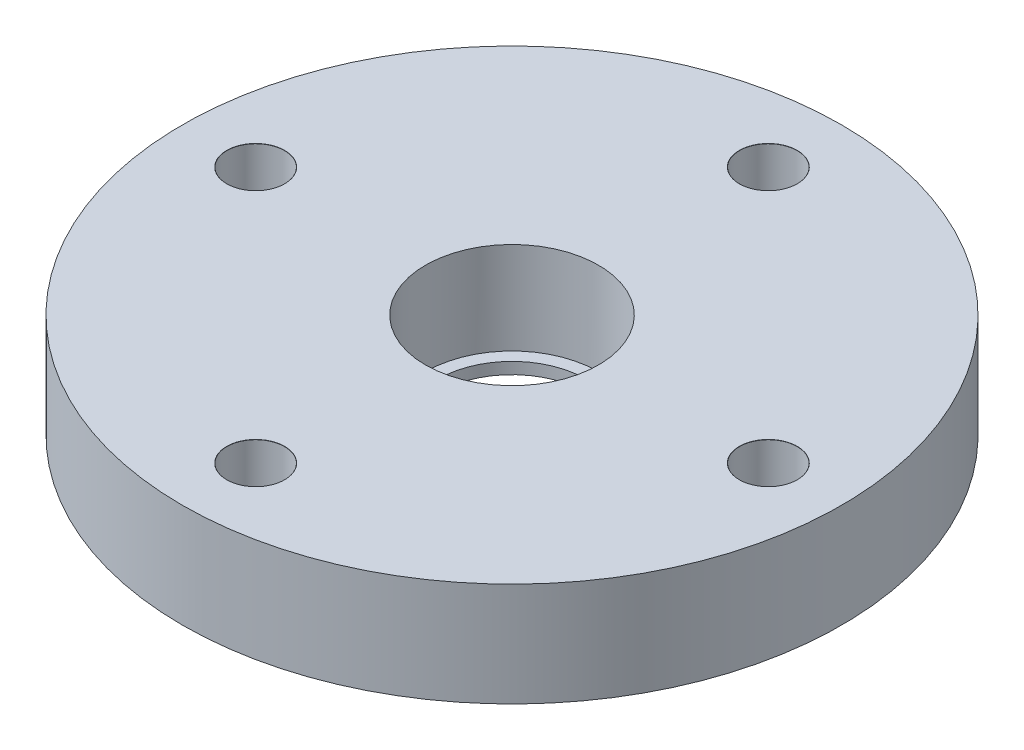
ISO-10303-21;
HEADER;
FILE_DESCRIPTION(('STEP AP214'),'2;1');
FILE_NAME('part.step','',(''),(''),'','','');
FILE_SCHEMA(('AUTOMOTIVE_DESIGN { 1 0 10303 214 1 1 1 1 }'));
ENDSEC;
DATA;
#1=APPLICATION_CONTEXT('core data for automotive mechanical design processes');
#2=APPLICATION_PROTOCOL_DEFINITION('international standard','automotive_design',2000,#1);
#3=PRODUCT_CONTEXT('',#1,'mechanical');
#4=PRODUCT('Part','Part','',(#3));
#5=PRODUCT_RELATED_PRODUCT_CATEGORY('part','',(#4));
#6=PRODUCT_DEFINITION_FORMATION('','',#4);
#7=PRODUCT_DEFINITION_CONTEXT('part definition',#1,'design');
#8=PRODUCT_DEFINITION('design','',#6,#7);
#9=PRODUCT_DEFINITION_SHAPE('','',#8);
#10=(LENGTH_UNIT() NAMED_UNIT(*) SI_UNIT(.MILLI.,.METRE.));
#11=(NAMED_UNIT(*) PLANE_ANGLE_UNIT() SI_UNIT($,.RADIAN.));
#12=(NAMED_UNIT(*) SI_UNIT($,.STERADIAN.) SOLID_ANGLE_UNIT());
#13=UNCERTAINTY_MEASURE_WITH_UNIT(LENGTH_MEASURE(1.E-05),#10,'distance_accuracy_value','');
#14=(GEOMETRIC_REPRESENTATION_CONTEXT(3) GLOBAL_UNCERTAINTY_ASSIGNED_CONTEXT((#13)) GLOBAL_UNIT_ASSIGNED_CONTEXT((#10,
#11,#12)) REPRESENTATION_CONTEXT('',''));
#15=CARTESIAN_POINT('',(0.,0.,0.));
#16=DIRECTION('',(0.,0.,1.));
#17=DIRECTION('',(1.,0.,0.));
#18=AXIS2_PLACEMENT_3D('',#15,#16,#17);
#19=CARTESIAN_POINT('',(0.,175.644610179245,0.));
#20=DIRECTION('',(0.,-1.,0.));
#21=DIRECTION('',(0.,0.,-1.));
#22=AXIS2_PLACEMENT_3D('',#19,#20,#21);
#23=CYLINDRICAL_SURFACE('',#22,57.15);
#24=CARTESIAN_POINT('',(0.,-2.,0.));
#25=DIRECTION('',(0.,-1.,0.));
#26=DIRECTION('',(0.,0.,-1.));
#27=AXIS2_PLACEMENT_3D('',#24,#25,#26);
#28=CIRCLE('',#27,57.15);
#29=CARTESIAN_POINT('',(0.,-2.,-57.15));
#30=VERTEX_POINT('',#29);
#31=EDGE_CURVE('E41',#30,#30,#28,.T.);
#32=ORIENTED_EDGE('',*,*,#31,.F.);
#33=EDGE_LOOP('',(#32));
#34=FACE_BOUND('',#33,.T.);
#35=CARTESIAN_POINT('',(0.,16.,0.));
#36=DIRECTION('',(0.,1.,0.));
#37=DIRECTION('',(0.,0.,1.));
#38=AXIS2_PLACEMENT_3D('',#35,#36,#37);
#39=CIRCLE('',#38,57.15);
#40=CARTESIAN_POINT('',(0.,16.,57.15));
#41=VERTEX_POINT('',#40);
#42=EDGE_CURVE('E53',#41,#41,#39,.T.);
#43=ORIENTED_EDGE('',*,*,#42,.F.);
#44=EDGE_LOOP('',(#43));
#45=FACE_BOUND('',#44,.T.);
#46=ADVANCED_FACE('F35',(#34,#45),#23,.T.);
#47=CARTESIAN_POINT('',(0.,-42.4264068711929,0.));
#48=DIRECTION('',(0.,1.,0.));
#49=DIRECTION('',(0.,0.,1.));
#50=AXIS2_PLACEMENT_3D('',#47,#48,#49);
#51=CYLINDRICAL_SURFACE('',#50,15.);
#52=CARTESIAN_POINT('',(0.,0.,0.));
#53=DIRECTION('',(0.,-1.,0.));
#54=DIRECTION('',(0.,0.,-1.));
#55=AXIS2_PLACEMENT_3D('',#52,#53,#54);
#56=CIRCLE('',#55,15.);
#57=CARTESIAN_POINT('',(0.,0.,-15.));
#58=VERTEX_POINT('',#57);
#59=EDGE_CURVE('E10',#58,#58,#56,.F.);
#60=ORIENTED_EDGE('',*,*,#59,.F.);
#61=EDGE_LOOP('',(#60));
#62=FACE_BOUND('',#61,.T.);
#63=CARTESIAN_POINT('',(0.,16.,0.));
#64=DIRECTION('',(0.,1.,0.));
#65=DIRECTION('',(0.,0.,1.));
#66=AXIS2_PLACEMENT_3D('',#63,#64,#65);
#67=CIRCLE('',#66,15.);
#68=CARTESIAN_POINT('',(0.,16.,15.));
#69=VERTEX_POINT('',#68);
#70=EDGE_CURVE('E57',#69,#69,#67,.T.);
#71=ORIENTED_EDGE('',*,*,#70,.T.);
#72=EDGE_LOOP('',(#71));
#73=FACE_BOUND('',#72,.T.);
#74=ADVANCED_FACE('F147',(#62,#73),#51,.F.);
#75=CARTESIAN_POINT('',(0.,0.,0.));
#76=DIRECTION('',(0.,-1.,0.));
#77=DIRECTION('',(0.,0.,-1.));
#78=AXIS2_PLACEMENT_3D('',#75,#76,#77);
#79=PLANE('',#78);
#80=CARTESIAN_POINT('',(0.,0.,0.));
#81=DIRECTION('',(0.,-1.,0.));
#82=DIRECTION('',(0.,0.,-1.));
#83=AXIS2_PLACEMENT_3D('',#80,#81,#82);
#84=CIRCLE('',#83,12.8);
#85=CARTESIAN_POINT('',(0.,0.,-12.8));
#86=VERTEX_POINT('',#85);
#87=EDGE_CURVE('E49',#86,#86,#84,.T.);
#88=ORIENTED_EDGE('',*,*,#87,.T.);
#89=EDGE_LOOP('',(#88));
#90=FACE_BOUND('',#89,.T.);
#91=ORIENTED_EDGE('',*,*,#59,.T.);
#92=EDGE_LOOP('',(#91));
#93=FACE_BOUND('',#92,.T.);
#94=ADVANCED_FACE('F149',(#90,#93),#79,.F.);
#95=CARTESIAN_POINT('',(0.,-2.,0.));
#96=DIRECTION('',(0.,-1.,0.));
#97=DIRECTION('',(0.,0.,-1.));
#98=AXIS2_PLACEMENT_3D('',#95,#96,#97);
#99=PLANE('',#98);
#100=CARTESIAN_POINT('',(0.,-2.,-44.45));
#101=DIRECTION('',(0.,1.,0.));
#102=DIRECTION('',(0.,0.,1.));
#103=AXIS2_PLACEMENT_3D('',#100,#101,#102);
#104=CIRCLE('',#103,5.025);
#105=CARTESIAN_POINT('',(0.,-2.,-39.425));
#106=VERTEX_POINT('',#105);
#107=EDGE_CURVE('E105',#106,#106,#104,.T.);
#108=ORIENTED_EDGE('',*,*,#107,.T.);
#109=EDGE_LOOP('',(#108));
#110=FACE_BOUND('',#109,.T.);
#111=CARTESIAN_POINT('',(44.4500000000025,-2.,-2.52124641334071E-12));
#112=DIRECTION('',(0.,1.,0.));
#113=DIRECTION('',(0.,0.,1.));
#114=AXIS2_PLACEMENT_3D('',#111,#112,#113);
#115=CIRCLE('',#114,5.025);
#116=CARTESIAN_POINT('',(44.4500000000025,-2.,5.02499999999747));
#117=VERTEX_POINT('',#116);
#118=EDGE_CURVE('E93',#117,#117,#115,.T.);
#119=ORIENTED_EDGE('',*,*,#118,.T.);
#120=EDGE_LOOP('',(#119));
#121=FACE_BOUND('',#120,.T.);
#122=CARTESIAN_POINT('',(5.04249282668141E-12,-2.,44.45));
#123=DIRECTION('',(0.,1.,0.));
#124=DIRECTION('',(0.,0.,1.));
#125=AXIS2_PLACEMENT_3D('',#122,#123,#124);
#126=CIRCLE('',#125,5.025);
#127=CARTESIAN_POINT('',(5.04249282668141E-12,-2.,49.475));
#128=VERTEX_POINT('',#127);
#129=EDGE_CURVE('E81',#128,#128,#126,.T.);
#130=ORIENTED_EDGE('',*,*,#129,.T.);
#131=EDGE_LOOP('',(#130));
#132=FACE_BOUND('',#131,.T.);
#133=CARTESIAN_POINT('',(-44.4499999999975,-2.,2.5158028583185E-12));
#134=DIRECTION('',(0.,1.,0.));
#135=DIRECTION('',(0.,0.,1.));
#136=AXIS2_PLACEMENT_3D('',#133,#134,#135);
#137=CIRCLE('',#136,5.025);
#138=CARTESIAN_POINT('',(-44.4499999999975,-2.,5.02500000000251));
#139=VERTEX_POINT('',#138);
#140=EDGE_CURVE('E69',#139,#139,#137,.T.);
#141=ORIENTED_EDGE('',*,*,#140,.T.);
#142=EDGE_LOOP('',(#141));
#143=FACE_BOUND('',#142,.T.);
#144=ORIENTED_EDGE('',*,*,#31,.T.);
#145=EDGE_LOOP('',(#144));
#146=FACE_BOUND('',#145,.T.);
#147=CARTESIAN_POINT('',(0.,-2.,0.));
#148=DIRECTION('',(0.,-1.,0.));
#149=DIRECTION('',(0.,0.,-1.));
#150=AXIS2_PLACEMENT_3D('',#147,#148,#149);
#151=CIRCLE('',#150,12.8);
#152=CARTESIAN_POINT('',(0.,-2.,-12.8));
#153=VERTEX_POINT('',#152);
#154=EDGE_CURVE('E45',#153,#153,#151,.T.);
#155=ORIENTED_EDGE('',*,*,#154,.F.);
#156=EDGE_LOOP('',(#155));
#157=FACE_BOUND('',#156,.T.);
#158=ADVANCED_FACE('F109',(#110,#121,#132,#143,#146,#157),#99,.T.);
#159=CARTESIAN_POINT('',(0.,-2.,0.));
#160=DIRECTION('',(0.,1.,0.));
#161=DIRECTION('',(0.,0.,1.));
#162=AXIS2_PLACEMENT_3D('',#159,#160,#161);
#163=CYLINDRICAL_SURFACE('',#162,12.8);
#164=ORIENTED_EDGE('',*,*,#154,.T.);
#165=EDGE_LOOP('',(#164));
#166=FACE_BOUND('',#165,.T.);
#167=ORIENTED_EDGE('',*,*,#87,.F.);
#168=EDGE_LOOP('',(#167));
#169=FACE_BOUND('',#168,.T.);
#170=ADVANCED_FACE('F135',(#166,#169),#163,.F.);
#171=CARTESIAN_POINT('',(0.,16.,0.));
#172=DIRECTION('',(0.,1.,0.));
#173=DIRECTION('',(0.,0.,1.));
#174=AXIS2_PLACEMENT_3D('',#171,#172,#173);
#175=PLANE('',#174);
#176=CARTESIAN_POINT('',(0.,16.,-44.45));
#177=DIRECTION('',(0.,1.,0.));
#178=DIRECTION('',(0.,0.,1.));
#179=AXIS2_PLACEMENT_3D('',#176,#177,#178);
#180=CIRCLE('',#179,5.025);
#181=CARTESIAN_POINT('',(0.,16.,-39.425));
#182=VERTEX_POINT('',#181);
#183=EDGE_CURVE('E102',#182,#182,#180,.T.);
#184=ORIENTED_EDGE('',*,*,#183,.F.);
#185=EDGE_LOOP('',(#184));
#186=FACE_BOUND('',#185,.T.);
#187=CARTESIAN_POINT('',(44.4500000000025,16.,-2.52124641334071E-12));
#188=DIRECTION('',(0.,1.,0.));
#189=DIRECTION('',(0.,0.,1.));
#190=AXIS2_PLACEMENT_3D('',#187,#188,#189);
#191=CIRCLE('',#190,5.025);
#192=CARTESIAN_POINT('',(44.4500000000025,16.,5.02499999999748));
#193=VERTEX_POINT('',#192);
#194=EDGE_CURVE('E90',#193,#193,#191,.T.);
#195=ORIENTED_EDGE('',*,*,#194,.F.);
#196=EDGE_LOOP('',(#195));
#197=FACE_BOUND('',#196,.T.);
#198=CARTESIAN_POINT('',(5.04249282668141E-12,16.,44.45));
#199=DIRECTION('',(0.,1.,0.));
#200=DIRECTION('',(0.,0.,1.));
#201=AXIS2_PLACEMENT_3D('',#198,#199,#200);
#202=CIRCLE('',#201,5.025);
#203=CARTESIAN_POINT('',(5.04249282668141E-12,16.,49.475));
#204=VERTEX_POINT('',#203);
#205=EDGE_CURVE('E78',#204,#204,#202,.T.);
#206=ORIENTED_EDGE('',*,*,#205,.F.);
#207=EDGE_LOOP('',(#206));
#208=FACE_BOUND('',#207,.T.);
#209=CARTESIAN_POINT('',(-44.4499999999975,16.,2.5158028583185E-12));
#210=DIRECTION('',(0.,1.,0.));
#211=DIRECTION('',(0.,0.,1.));
#212=AXIS2_PLACEMENT_3D('',#209,#210,#211);
#213=CIRCLE('',#212,5.025);
#214=CARTESIAN_POINT('',(-44.4499999999975,16.,5.02500000000252));
#215=VERTEX_POINT('',#214);
#216=EDGE_CURVE('E66',#215,#215,#213,.T.);
#217=ORIENTED_EDGE('',*,*,#216,.F.);
#218=EDGE_LOOP('',(#217));
#219=FACE_BOUND('',#218,.T.);
#220=ORIENTED_EDGE('',*,*,#42,.T.);
#221=EDGE_LOOP('',(#220));
#222=FACE_BOUND('',#221,.T.);
#223=ORIENTED_EDGE('',*,*,#70,.F.);
#224=EDGE_LOOP('',(#223));
#225=FACE_BOUND('',#224,.T.);
#226=ADVANCED_FACE('F131',(#186,#197,#208,#219,#222,#225),#175,.T.);
#227=CARTESIAN_POINT('',(-44.4499999999975,-1.975,2.5158028583185E-12));
#228=DIRECTION('',(0.,-1.,0.));
#229=DIRECTION('',(0.,0.,-1.));
#230=AXIS2_PLACEMENT_3D('',#227,#228,#229);
#231=CONICAL_SURFACE('',#230,5.,0.785398163397448);
#232=ORIENTED_EDGE('',*,*,#140,.F.);
#233=EDGE_LOOP('',(#232));
#234=FACE_BOUND('',#233,.T.);
#235=CARTESIAN_POINT('',(-44.4499999999975,-1.975,2.5158028583185E-12));
#236=DIRECTION('',(0.,1.,0.));
#237=DIRECTION('',(0.,0.,1.));
#238=AXIS2_PLACEMENT_3D('',#235,#236,#237);
#239=CIRCLE('',#238,5.);
#240=CARTESIAN_POINT('',(-44.4499999999975,-1.975,5.00000000000251));
#241=VERTEX_POINT('',#240);
#242=EDGE_CURVE('E60',#241,#241,#239,.T.);
#243=ORIENTED_EDGE('',*,*,#242,.T.);
#244=EDGE_LOOP('',(#243));
#245=FACE_BOUND('',#244,.T.);
#246=ADVANCED_FACE('F134',(#234,#245),#231,.F.);
#247=CARTESIAN_POINT('',(-44.4499999999975,16.,2.5158028583185E-12));
#248=DIRECTION('',(0.,1.,0.));
#249=DIRECTION('',(0.,0.,1.));
#250=AXIS2_PLACEMENT_3D('',#247,#248,#249);
#251=CYLINDRICAL_SURFACE('',#250,4.99999999999999);
#252=ORIENTED_EDGE('',*,*,#242,.F.);
#253=EDGE_LOOP('',(#252));
#254=FACE_BOUND('',#253,.T.);
#255=CARTESIAN_POINT('',(-44.4499999999975,15.975,2.5158028583185E-12));
#256=DIRECTION('',(0.,1.,0.));
#257=DIRECTION('',(0.,0.,1.));
#258=AXIS2_PLACEMENT_3D('',#255,#256,#257);
#259=CIRCLE('',#258,4.99999999999999);
#260=CARTESIAN_POINT('',(-44.4499999999975,15.975,5.00000000000251));
#261=VERTEX_POINT('',#260);
#262=EDGE_CURVE('E63',#261,#261,#259,.T.);
#263=ORIENTED_EDGE('',*,*,#262,.T.);
#264=EDGE_LOOP('',(#263));
#265=FACE_BOUND('',#264,.T.);
#266=ADVANCED_FACE('F166',(#254,#265),#251,.F.);
#267=CARTESIAN_POINT('',(-44.4499999999975,16.,2.5158028583185E-12));
#268=DIRECTION('',(0.,1.,0.));
#269=DIRECTION('',(0.,0.,1.));
#270=AXIS2_PLACEMENT_3D('',#267,#268,#269);
#271=CONICAL_SURFACE('',#270,5.025,0.785398163397379);
#272=ORIENTED_EDGE('',*,*,#262,.F.);
#273=EDGE_LOOP('',(#272));
#274=FACE_BOUND('',#273,.T.);
#275=ORIENTED_EDGE('',*,*,#216,.T.);
#276=EDGE_LOOP('',(#275));
#277=FACE_BOUND('',#276,.T.);
#278=ADVANCED_FACE('F170',(#274,#277),#271,.F.);
#279=CARTESIAN_POINT('',(5.04249282668141E-12,-1.975,44.45));
#280=DIRECTION('',(0.,-1.,0.));
#281=DIRECTION('',(0.,0.,-1.));
#282=AXIS2_PLACEMENT_3D('',#279,#280,#281);
#283=CONICAL_SURFACE('',#282,5.,0.7853981633975);
#284=ORIENTED_EDGE('',*,*,#129,.F.);
#285=EDGE_LOOP('',(#284));
#286=FACE_BOUND('',#285,.T.);
#287=CARTESIAN_POINT('',(5.04249282668141E-12,-1.975,44.45));
#288=DIRECTION('',(0.,1.,0.));
#289=DIRECTION('',(0.,0.,1.));
#290=AXIS2_PLACEMENT_3D('',#287,#288,#289);
#291=CIRCLE('',#290,5.);
#292=CARTESIAN_POINT('',(5.04249282668141E-12,-1.975,49.45));
#293=VERTEX_POINT('',#292);
#294=EDGE_CURVE('E72',#293,#293,#291,.T.);
#295=ORIENTED_EDGE('',*,*,#294,.T.);
#296=EDGE_LOOP('',(#295));
#297=FACE_BOUND('',#296,.T.);
#298=ADVANCED_FACE('F174',(#286,#297),#283,.F.);
#299=CARTESIAN_POINT('',(5.04249282668141E-12,16.,44.45));
#300=DIRECTION('',(0.,1.,0.));
#301=DIRECTION('',(0.,0.,1.));
#302=AXIS2_PLACEMENT_3D('',#299,#300,#301);
#303=CYLINDRICAL_SURFACE('',#302,4.99999999999999);
#304=ORIENTED_EDGE('',*,*,#294,.F.);
#305=EDGE_LOOP('',(#304));
#306=FACE_BOUND('',#305,.T.);
#307=CARTESIAN_POINT('',(5.04249282668141E-12,15.975,44.45));
#308=DIRECTION('',(0.,1.,0.));
#309=DIRECTION('',(0.,0.,1.));
#310=AXIS2_PLACEMENT_3D('',#307,#308,#309);
#311=CIRCLE('',#310,4.99999999999999);
#312=CARTESIAN_POINT('',(5.04249282668141E-12,15.975,49.45));
#313=VERTEX_POINT('',#312);
#314=EDGE_CURVE('E75',#313,#313,#311,.T.);
#315=ORIENTED_EDGE('',*,*,#314,.T.);
#316=EDGE_LOOP('',(#315));
#317=FACE_BOUND('',#316,.T.);
#318=ADVANCED_FACE('F178',(#306,#317),#303,.F.);
#319=CARTESIAN_POINT('',(5.04249282668141E-12,16.,44.45));
#320=DIRECTION('',(0.,1.,0.));
#321=DIRECTION('',(0.,0.,1.));
#322=AXIS2_PLACEMENT_3D('',#319,#320,#321);
#323=CONICAL_SURFACE('',#322,5.025,0.785398163397431);
#324=ORIENTED_EDGE('',*,*,#314,.F.);
#325=EDGE_LOOP('',(#324));
#326=FACE_BOUND('',#325,.T.);
#327=ORIENTED_EDGE('',*,*,#205,.T.);
#328=EDGE_LOOP('',(#327));
#329=FACE_BOUND('',#328,.T.);
#330=ADVANCED_FACE('F182',(#326,#329),#323,.F.);
#331=CARTESIAN_POINT('',(44.4500000000025,-1.975,-2.52124641334071E-12));
#332=DIRECTION('',(0.,-1.,0.));
#333=DIRECTION('',(0.,0.,-1.));
#334=AXIS2_PLACEMENT_3D('',#331,#332,#333);
#335=CONICAL_SURFACE('',#334,5.,0.785398163397448);
#336=ORIENTED_EDGE('',*,*,#118,.F.);
#337=EDGE_LOOP('',(#336));
#338=FACE_BOUND('',#337,.T.);
#339=CARTESIAN_POINT('',(44.4500000000025,-1.975,-2.52124641334071E-12));
#340=DIRECTION('',(0.,1.,0.));
#341=DIRECTION('',(0.,0.,1.));
#342=AXIS2_PLACEMENT_3D('',#339,#340,#341);
#343=CIRCLE('',#342,5.);
#344=CARTESIAN_POINT('',(44.4500000000025,-1.975,4.99999999999748));
#345=VERTEX_POINT('',#344);
#346=EDGE_CURVE('E84',#345,#345,#343,.T.);
#347=ORIENTED_EDGE('',*,*,#346,.T.);
#348=EDGE_LOOP('',(#347));
#349=FACE_BOUND('',#348,.T.);
#350=ADVANCED_FACE('F186',(#338,#349),#335,.F.);
#351=CARTESIAN_POINT('',(44.4500000000025,16.,-2.52124641334071E-12));
#352=DIRECTION('',(0.,1.,0.));
#353=DIRECTION('',(0.,0.,1.));
#354=AXIS2_PLACEMENT_3D('',#351,#352,#353);
#355=CYLINDRICAL_SURFACE('',#354,4.99999999999999);
#356=ORIENTED_EDGE('',*,*,#346,.F.);
#357=EDGE_LOOP('',(#356));
#358=FACE_BOUND('',#357,.T.);
#359=CARTESIAN_POINT('',(44.4500000000025,15.975,-2.52124641334071E-12));
#360=DIRECTION('',(0.,1.,0.));
#361=DIRECTION('',(0.,0.,1.));
#362=AXIS2_PLACEMENT_3D('',#359,#360,#361);
#363=CIRCLE('',#362,4.99999999999999);
#364=CARTESIAN_POINT('',(44.4500000000025,15.975,4.99999999999747));
#365=VERTEX_POINT('',#364);
#366=EDGE_CURVE('E87',#365,#365,#363,.T.);
#367=ORIENTED_EDGE('',*,*,#366,.T.);
#368=EDGE_LOOP('',(#367));
#369=FACE_BOUND('',#368,.T.);
#370=ADVANCED_FACE('F190',(#358,#369),#355,.F.);
#371=CARTESIAN_POINT('',(44.4500000000025,16.,-2.52124641334071E-12));
#372=DIRECTION('',(0.,1.,0.));
#373=DIRECTION('',(0.,0.,1.));
#374=AXIS2_PLACEMENT_3D('',#371,#372,#373);
#375=CONICAL_SURFACE('',#374,5.025,0.785398163397379);
#376=ORIENTED_EDGE('',*,*,#366,.F.);
#377=EDGE_LOOP('',(#376));
#378=FACE_BOUND('',#377,.T.);
#379=ORIENTED_EDGE('',*,*,#194,.T.);
#380=EDGE_LOOP('',(#379));
#381=FACE_BOUND('',#380,.T.);
#382=ADVANCED_FACE('F116',(#378,#381),#375,.F.);
#383=CARTESIAN_POINT('',(0.,-1.975,-44.45));
#384=DIRECTION('',(0.,-1.,0.));
#385=DIRECTION('',(0.,0.,-1.));
#386=AXIS2_PLACEMENT_3D('',#383,#384,#385);
#387=CONICAL_SURFACE('',#386,5.,0.7853981633975);
#388=ORIENTED_EDGE('',*,*,#107,.F.);
#389=EDGE_LOOP('',(#388));
#390=FACE_BOUND('',#389,.T.);
#391=CARTESIAN_POINT('',(0.,-1.975,-44.45));
#392=DIRECTION('',(0.,1.,0.));
#393=DIRECTION('',(0.,0.,1.));
#394=AXIS2_PLACEMENT_3D('',#391,#392,#393);
#395=CIRCLE('',#394,5.);
#396=CARTESIAN_POINT('',(0.,-1.975,-39.45));
#397=VERTEX_POINT('',#396);
#398=EDGE_CURVE('E96',#397,#397,#395,.T.);
#399=ORIENTED_EDGE('',*,*,#398,.T.);
#400=EDGE_LOOP('',(#399));
#401=FACE_BOUND('',#400,.T.);
#402=ADVANCED_FACE('F112',(#390,#401),#387,.F.);
#403=CARTESIAN_POINT('',(0.,16.,-44.45));
#404=DIRECTION('',(0.,1.,0.));
#405=DIRECTION('',(0.,0.,1.));
#406=AXIS2_PLACEMENT_3D('',#403,#404,#405);
#407=CYLINDRICAL_SURFACE('',#406,4.99999999999999);
#408=ORIENTED_EDGE('',*,*,#398,.F.);
#409=EDGE_LOOP('',(#408));
#410=FACE_BOUND('',#409,.T.);
#411=CARTESIAN_POINT('',(0.,15.975,-44.45));
#412=DIRECTION('',(0.,1.,0.));
#413=DIRECTION('',(0.,0.,1.));
#414=AXIS2_PLACEMENT_3D('',#411,#412,#413);
#415=CIRCLE('',#414,4.99999999999999);
#416=CARTESIAN_POINT('',(0.,15.975,-39.45));
#417=VERTEX_POINT('',#416);
#418=EDGE_CURVE('E99',#417,#417,#415,.T.);
#419=ORIENTED_EDGE('',*,*,#418,.T.);
#420=EDGE_LOOP('',(#419));
#421=FACE_BOUND('',#420,.T.);
#422=ADVANCED_FACE('F115',(#410,#421),#407,.F.);
#423=CARTESIAN_POINT('',(0.,16.,-44.45));
#424=DIRECTION('',(0.,1.,0.));
#425=DIRECTION('',(0.,0.,1.));
#426=AXIS2_PLACEMENT_3D('',#423,#424,#425);
#427=CONICAL_SURFACE('',#426,5.025,0.785398163397431);
#428=ORIENTED_EDGE('',*,*,#418,.F.);
#429=EDGE_LOOP('',(#428));
#430=FACE_BOUND('',#429,.T.);
#431=ORIENTED_EDGE('',*,*,#183,.T.);
#432=EDGE_LOOP('',(#431));
#433=FACE_BOUND('',#432,.T.);
#434=ADVANCED_FACE('F122',(#430,#433),#427,.F.);
#435=CLOSED_SHELL('',(#46,#74,#94,#158,#170,#226,#246,#266,#278,#298,#318,#330,#350,#370,#382,
#402,#422,#434));
#436=MANIFOLD_SOLID_BREP('B2',#435);
#437=ADVANCED_BREP_SHAPE_REPRESENTATION('',(#18,#436),#14);
#438=SHAPE_DEFINITION_REPRESENTATION(#9,#437);
ENDSEC;
END-ISO-10303-21;
